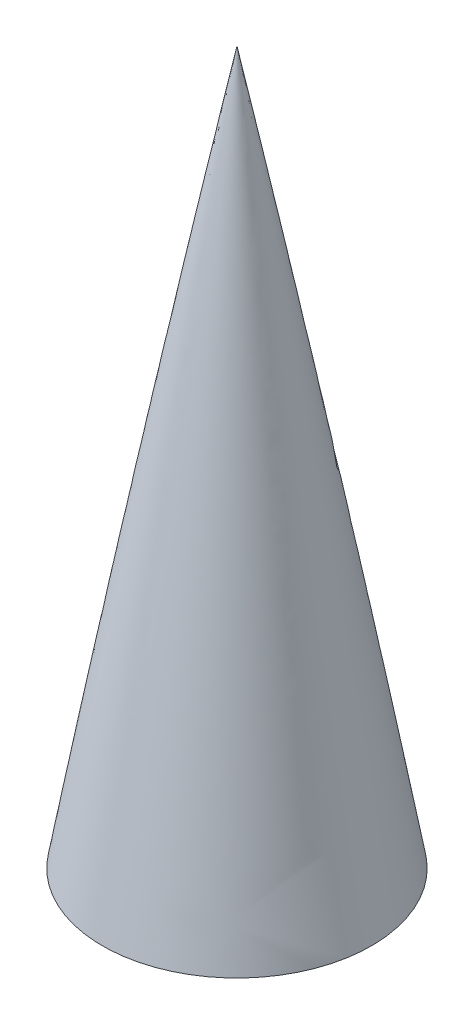
ISO-10303-21;
HEADER;
FILE_DESCRIPTION(('STEP AP214'),'2;1');
FILE_NAME('part.step','',(''),(''),'','','');
FILE_SCHEMA(('AUTOMOTIVE_DESIGN { 1 0 10303 214 1 1 1 1 }'));
ENDSEC;
DATA;
#1=APPLICATION_CONTEXT('core data for automotive mechanical design processes');
#2=APPLICATION_PROTOCOL_DEFINITION('international standard','automotive_design',2000,#1);
#3=PRODUCT_CONTEXT('',#1,'mechanical');
#4=PRODUCT('Part','Part','',(#3));
#5=PRODUCT_RELATED_PRODUCT_CATEGORY('part','',(#4));
#6=PRODUCT_DEFINITION_FORMATION('','',#4);
#7=PRODUCT_DEFINITION_CONTEXT('part definition',#1,'design');
#8=PRODUCT_DEFINITION('design','',#6,#7);
#9=PRODUCT_DEFINITION_SHAPE('','',#8);
#10=(LENGTH_UNIT() NAMED_UNIT(*) SI_UNIT(.MILLI.,.METRE.));
#11=(NAMED_UNIT(*) PLANE_ANGLE_UNIT() SI_UNIT($,.RADIAN.));
#12=(NAMED_UNIT(*) SI_UNIT($,.STERADIAN.) SOLID_ANGLE_UNIT());
#13=UNCERTAINTY_MEASURE_WITH_UNIT(LENGTH_MEASURE(1.E-05),#10,'distance_accuracy_value','');
#14=(GEOMETRIC_REPRESENTATION_CONTEXT(3) GLOBAL_UNCERTAINTY_ASSIGNED_CONTEXT((#13)) GLOBAL_UNIT_ASSIGNED_CONTEXT((#10,
#11,#12)) REPRESENTATION_CONTEXT('',''));
#15=CARTESIAN_POINT('',(0.,0.,0.));
#16=DIRECTION('',(0.,0.,1.));
#17=DIRECTION('',(1.,0.,0.));
#18=AXIS2_PLACEMENT_3D('',#15,#16,#17);
#19=CARTESIAN_POINT('',(2621.56084303051,177.799999999997,0.));
#20=DIRECTION('',(0.,1.,0.));
#21=DIRECTION('',(0.,0.,1.));
#22=AXIS2_PLACEMENT_3D('',#19,#20,#21);
#23=PLANE('',#22);
#24=CARTESIAN_POINT('',(2626.35999999999,177.799999999997,0.));
#25=DIRECTION('',(0.,-1.,0.));
#26=DIRECTION('',(0.,0.,-1.));
#27=AXIS2_PLACEMENT_3D('',#24,#25,#26);
#28=CIRCLE('',#27,4.79915696948918);
#29=CARTESIAN_POINT('',(2626.35999999999,177.799999999997,-4.79915696948918));
#30=VERTEX_POINT('',#29);
#31=EDGE_CURVE('E11',#30,#30,#28,.T.);
#32=ORIENTED_EDGE('',*,*,#31,.T.);
#33=EDGE_LOOP('',(#32));
#34=FACE_BOUND('',#33,.T.);
#35=ADVANCED_FACE('F32',(#34),#23,.F.);
#36=CARTESIAN_POINT('',(2626.35999999999,-2.72004641033163E-12,1005.84));
#37=DIRECTION('',(-1.,0.,0.));
#38=DIRECTION('',(0.,0.,-1.));
#39=AXIS2_PLACEMENT_3D('',#36,#37,#38);
#40=CIRCLE('',#39,1026.16);
#41=TRIMMED_CURVE('',#40,(PARAMETER_VALUE(-0.199337304982324)),
(PARAMETER_VALUE(0.199337304982324)),.T.,.PARAMETER.);
#42=CARTESIAN_POINT('',(2626.35999999999,-2.72004641033163E-12,0.));
#43=DIRECTION('',(0.,-1.,0.));
#44=AXIS1_PLACEMENT('',#42,#43);
#45=SURFACE_OF_REVOLUTION('',#41,#44);
#46=CARTESIAN_POINT('',(2626.35999999999,203.199999999997,0.));
#47=VERTEX_POINT('',#46);
#48=VERTEX_LOOP('',#47);
#49=FACE_BOUND('',#48,.T.);
#50=ORIENTED_EDGE('',*,*,#31,.F.);
#51=EDGE_LOOP('',(#50));
#52=FACE_BOUND('',#51,.T.);
#53=ADVANCED_FACE('F39',(#49,#52),#45,.T.);
#54=CLOSED_SHELL('',(#35,#53));
#55=MANIFOLD_SOLID_BREP('B2',#54);
#56=ADVANCED_BREP_SHAPE_REPRESENTATION('',(#18,#55),#14);
#57=SHAPE_DEFINITION_REPRESENTATION(#9,#56);
ENDSEC;
END-ISO-10303-21;
